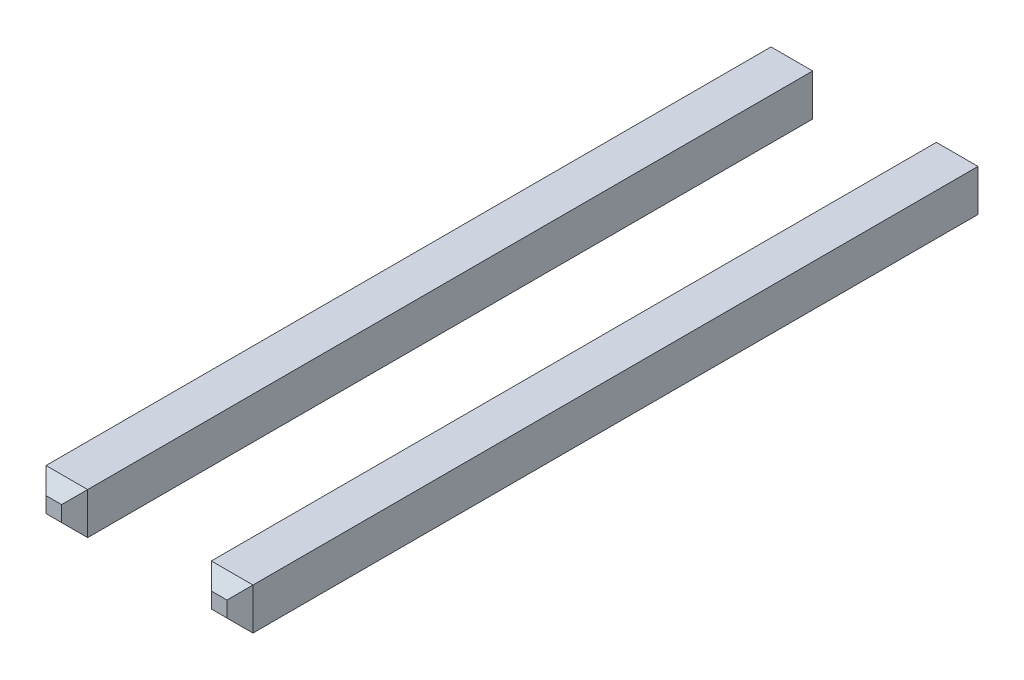
ISO-10303-21;
HEADER;
FILE_DESCRIPTION(('STEP AP214'),'2;1');
FILE_NAME('part.step','',(''),(''),'','','');
FILE_SCHEMA(('AUTOMOTIVE_DESIGN { 1 0 10303 214 1 1 1 1 }'));
ENDSEC;
DATA;
#1=APPLICATION_CONTEXT('core data for automotive mechanical design processes');
#2=APPLICATION_PROTOCOL_DEFINITION('international standard','automotive_design',2000,#1);
#3=PRODUCT_CONTEXT('',#1,'mechanical');
#4=PRODUCT('Part','Part','',(#3));
#5=PRODUCT_RELATED_PRODUCT_CATEGORY('part','',(#4));
#6=PRODUCT_DEFINITION_FORMATION('','',#4);
#7=PRODUCT_DEFINITION_CONTEXT('part definition',#1,'design');
#8=PRODUCT_DEFINITION('design','',#6,#7);
#9=PRODUCT_DEFINITION_SHAPE('','',#8);
#10=(LENGTH_UNIT() NAMED_UNIT(*) SI_UNIT(.MILLI.,.METRE.));
#11=(NAMED_UNIT(*) PLANE_ANGLE_UNIT() SI_UNIT($,.RADIAN.));
#12=(NAMED_UNIT(*) SI_UNIT($,.STERADIAN.) SOLID_ANGLE_UNIT());
#13=UNCERTAINTY_MEASURE_WITH_UNIT(LENGTH_MEASURE(1.E-05),#10,'distance_accuracy_value','');
#14=(GEOMETRIC_REPRESENTATION_CONTEXT(3) GLOBAL_UNCERTAINTY_ASSIGNED_CONTEXT((#13)) GLOBAL_UNIT_ASSIGNED_CONTEXT((#10,
#11,#12)) REPRESENTATION_CONTEXT('',''));
#15=CARTESIAN_POINT('',(0.,0.,0.));
#16=DIRECTION('',(0.,0.,1.));
#17=DIRECTION('',(1.,0.,0.));
#18=AXIS2_PLACEMENT_3D('',#15,#16,#17);
#19=CARTESIAN_POINT('',(2.859999961853,-0.21999999851,-2.89999999851));
#20=DIRECTION('',(0.,0.707106781186548,0.707106781186548));
#21=DIRECTION('',(0.,-0.707106781186548,0.707106781186548));
#22=AXIS2_PLACEMENT_3D('',#19,#20,#21);
#23=PLANE('',#22);
#24=DIRECTION('',(0.577350269189626,0.577350269189625,-0.577350269189626));
#25=VECTOR('',#24,1.);
#26=CARTESIAN_POINT('',(2.219999961853,-0.32,-2.79999999702));
#27=LINE('',#26,#25);
#28=CARTESIAN_POINT('',(2.219999961853,-0.32,-2.79999999702));
#29=VERTEX_POINT('',#28);
#30=CARTESIAN_POINT('',(2.419999964833,-0.11999999702,-3.));
#31=VERTEX_POINT('',#30);
#32=EDGE_CURVE('P0_E78',#29,#31,#27,.T.);
#33=ORIENTED_EDGE('',*,*,#32,.T.);
#34=DIRECTION('',(1.,0.,0.));
#35=VECTOR('',#34,1.);
#36=CARTESIAN_POINT('',(2.219999961853,-0.11999999702,-3.));
#37=LINE('',#36,#35);
#38=CARTESIAN_POINT('',(2.659999958873,-0.11999999702,-3.));
#39=VERTEX_POINT('',#38);
#40=EDGE_CURVE('P0_E19',#31,#39,#37,.T.);
#41=ORIENTED_EDGE('',*,*,#40,.T.);
#42=DIRECTION('',(0.577350269189626,-0.577350269189625,0.577350269189626));
#43=VECTOR('',#42,1.);
#44=CARTESIAN_POINT('',(2.659999958873,-0.11999999702,-3.));
#45=LINE('',#44,#43);
#46=CARTESIAN_POINT('',(2.859999961853,-0.32,-2.79999999702));
#47=VERTEX_POINT('',#46);
#48=EDGE_CURVE('P0_E82',#39,#47,#45,.T.);
#49=ORIENTED_EDGE('',*,*,#48,.T.);
#50=DIRECTION('',(1.,0.,0.));
#51=VECTOR('',#50,1.);
#52=CARTESIAN_POINT('',(2.859999961853,-0.32,-2.79999999702));
#53=LINE('',#52,#51);
#54=EDGE_CURVE('P0_E103',#29,#47,#53,.T.);
#55=ORIENTED_EDGE('',*,*,#54,.F.);
#56=EDGE_LOOP('',(#33,#41,#49,#55));
#57=FACE_BOUND('',#56,.T.);
#58=ADVANCED_FACE('P0_F16',(#57),#23,.F.);
#59=CARTESIAN_POINT('',(2.859999961853,-0.21999999851,8.439999960363));
#60=DIRECTION('',(0.,-0.707106781186548,0.707106781186548));
#61=DIRECTION('',(0.,-0.707106781186548,-0.707106781186548));
#62=AXIS2_PLACEMENT_3D('',#59,#60,#61);
#63=PLANE('',#62);
#64=DIRECTION('',(1.,0.,0.));
#65=VECTOR('',#64,1.);
#66=CARTESIAN_POINT('',(2.219999961853,-0.11999999702,8.539999961853));
#67=LINE('',#66,#65);
#68=CARTESIAN_POINT('',(2.419999964833,-0.11999999702,8.539999961853));
#69=VERTEX_POINT('',#68);
#70=CARTESIAN_POINT('',(2.659999958873,-0.11999999702,8.539999961853));
#71=VERTEX_POINT('',#70);
#72=EDGE_CURVE('P0_E113',#69,#71,#67,.T.);
#73=ORIENTED_EDGE('',*,*,#72,.F.);
#74=DIRECTION('',(0.577350269189627,0.577350269189625,0.577350269189626));
#75=VECTOR('',#74,1.);
#76=CARTESIAN_POINT('',(2.219999961853,-0.32,8.339999958873));
#77=LINE('',#76,#75);
#78=CARTESIAN_POINT('',(2.219999961853,-0.32,8.339999958873));
#79=VERTEX_POINT('',#78);
#80=EDGE_CURVE('P0_E108',#79,#69,#77,.T.);
#81=ORIENTED_EDGE('',*,*,#80,.F.);
#82=DIRECTION('',(1.,0.,0.));
#83=VECTOR('',#82,1.);
#84=CARTESIAN_POINT('',(2.859999961853,-0.32,8.339999958873));
#85=LINE('',#84,#83);
#86=CARTESIAN_POINT('',(2.859999961853,-0.32,8.339999958873));
#87=VERTEX_POINT('',#86);
#88=EDGE_CURVE('P0_E105',#87,#79,#85,.F.);
#89=ORIENTED_EDGE('',*,*,#88,.F.);
#90=DIRECTION('',(0.577350269189627,-0.577350269189625,-0.577350269189626));
#91=VECTOR('',#90,1.);
#92=CARTESIAN_POINT('',(2.659999958873,-0.11999999702,8.539999961853));
#93=LINE('',#92,#91);
#94=EDGE_CURVE('P0_E118',#71,#87,#93,.T.);
#95=ORIENTED_EDGE('',*,*,#94,.F.);
#96=EDGE_LOOP('',(#73,#81,#89,#95));
#97=FACE_BOUND('',#96,.T.);
#98=ADVANCED_FACE('P0_F183',(#97),#63,.T.);
#99=CARTESIAN_POINT('',(2.219999961853,0.32,-3.));
#100=DIRECTION('',(0.,0.,1.));
#101=DIRECTION('',(1.,0.,0.));
#102=AXIS2_PLACEMENT_3D('',#99,#100,#101);
#103=PLANE('',#102);
#104=DIRECTION('',(0.,1.,0.));
#105=VECTOR('',#104,1.);
#106=CARTESIAN_POINT('',(2.659999958873,0.32,-3.));
#107=LINE('',#106,#105);
#108=CARTESIAN_POINT('',(2.659999958873,0.11999999702,-3.));
#109=VERTEX_POINT('',#108);
#110=EDGE_CURVE('P0_E86',#109,#39,#107,.F.);
#111=ORIENTED_EDGE('',*,*,#110,.T.);
#112=ORIENTED_EDGE('',*,*,#40,.F.);
#113=DIRECTION('',(0.,1.,0.));
#114=VECTOR('',#113,1.);
#115=CARTESIAN_POINT('',(2.419999964833,-0.32,-3.));
#116=LINE('',#115,#114);
#117=CARTESIAN_POINT('',(2.419999964833,0.11999999702,-3.));
#118=VERTEX_POINT('',#117);
#119=EDGE_CURVE('P0_E99',#31,#118,#116,.T.);
#120=ORIENTED_EDGE('',*,*,#119,.T.);
#121=DIRECTION('',(1.,0.,0.));
#122=VECTOR('',#121,1.);
#123=CARTESIAN_POINT('',(2.219999961853,0.11999999702,-3.));
#124=LINE('',#123,#122);
#125=EDGE_CURVE('P0_E90',#118,#109,#124,.T.);
#126=ORIENTED_EDGE('',*,*,#125,.T.);
#127=EDGE_LOOP('',(#111,#112,#120,#126));
#128=FACE_BOUND('',#127,.T.);
#129=ADVANCED_FACE('P0_F88',(#128),#103,.F.);
#130=CARTESIAN_POINT('',(2.759999960363,0.32,-2.89999999851));
#131=DIRECTION('',(-0.707106781186548,0.,0.707106781186548));
#132=DIRECTION('',(0.707106781186548,0.,0.707106781186548));
#133=AXIS2_PLACEMENT_3D('',#130,#131,#132);
#134=PLANE('',#133);
#135=ORIENTED_EDGE('',*,*,#48,.F.);
#136=ORIENTED_EDGE('',*,*,#110,.F.);
#137=DIRECTION('',(0.577350269189625,0.577350269189626,0.577350269189626));
#138=VECTOR('',#137,1.);
#139=CARTESIAN_POINT('',(2.659999958873,0.11999999702,-3.));
#140=LINE('',#139,#138);
#141=CARTESIAN_POINT('',(2.859999961853,0.32,-2.79999999702));
#142=VERTEX_POINT('',#141);
#143=EDGE_CURVE('P0_E131',#109,#142,#140,.T.);
#144=ORIENTED_EDGE('',*,*,#143,.T.);
#145=DIRECTION('',(0.,1.,0.));
#146=VECTOR('',#145,1.);
#147=CARTESIAN_POINT('',(2.859999961853,0.32,-2.79999999702));
#148=LINE('',#147,#146);
#149=EDGE_CURVE('P0_E96',#47,#142,#148,.T.);
#150=ORIENTED_EDGE('',*,*,#149,.F.);
#151=EDGE_LOOP('',(#135,#136,#144,#150));
#152=FACE_BOUND('',#151,.T.);
#153=ADVANCED_FACE('P0_F94',(#152),#134,.F.);
#154=CARTESIAN_POINT('',(2.319999963343,-0.32,-2.89999999851));
#155=DIRECTION('',(0.707106781186548,0.,0.707106781186548));
#156=DIRECTION('',(0.707106781186548,0.,-0.707106781186548));
#157=AXIS2_PLACEMENT_3D('',#154,#155,#156);
#158=PLANE('',#157);
#159=DIRECTION('',(0.577350269189626,-0.577350269189626,-0.577350269189626));
#160=VECTOR('',#159,1.);
#161=CARTESIAN_POINT('',(2.219999961853,0.32,-2.79999999702));
#162=LINE('',#161,#160);
#163=CARTESIAN_POINT('',(2.219999961853,0.32,-2.79999999702));
#164=VERTEX_POINT('',#163);
#165=EDGE_CURVE('P0_E127',#164,#118,#162,.T.);
#166=ORIENTED_EDGE('',*,*,#165,.T.);
#167=ORIENTED_EDGE('',*,*,#119,.F.);
#168=ORIENTED_EDGE('',*,*,#32,.F.);
#169=DIRECTION('',(0.,1.,0.));
#170=VECTOR('',#169,1.);
#171=CARTESIAN_POINT('',(2.219999961853,-0.32,-2.79999999702));
#172=LINE('',#171,#170);
#173=EDGE_CURVE('P0_E133',#164,#29,#172,.F.);
#174=ORIENTED_EDGE('',*,*,#173,.F.);
#175=EDGE_LOOP('',(#166,#167,#168,#174));
#176=FACE_BOUND('',#175,.T.);
#177=ADVANCED_FACE('P0_F178',(#176),#158,.F.);
#178=CARTESIAN_POINT('',(2.859999961853,-0.32,-3.));
#179=DIRECTION('',(0.,-1.,0.));
#180=DIRECTION('',(0.,0.,-1.));
#181=AXIS2_PLACEMENT_3D('',#178,#179,#180);
#182=PLANE('',#181);
#183=DIRECTION('',(0.,0.,-1.));
#184=VECTOR('',#183,1.);
#185=CARTESIAN_POINT('',(2.859999961853,-0.32,-3.));
#186=LINE('',#185,#184);
#187=EDGE_CURVE('P0_E121',#87,#47,#186,.T.);
#188=ORIENTED_EDGE('',*,*,#187,.F.);
#189=ORIENTED_EDGE('',*,*,#88,.T.);
#190=DIRECTION('',(0.,0.,1.));
#191=VECTOR('',#190,1.);
#192=CARTESIAN_POINT('',(2.219999961853,-0.32,-3.));
#193=LINE('',#192,#191);
#194=EDGE_CURVE('P0_E136',#29,#79,#193,.T.);
#195=ORIENTED_EDGE('',*,*,#194,.F.);
#196=ORIENTED_EDGE('',*,*,#54,.T.);
#197=EDGE_LOOP('',(#188,#189,#195,#196));
#198=FACE_BOUND('',#197,.T.);
#199=ADVANCED_FACE('P0_F180',(#198),#182,.T.);
#200=CARTESIAN_POINT('',(2.319999963343,-0.32,8.439999960363));
#201=DIRECTION('',(-0.707106781186548,0.,0.707106781186548));
#202=DIRECTION('',(0.707106781186548,0.,0.707106781186548));
#203=AXIS2_PLACEMENT_3D('',#200,#201,#202);
#204=PLANE('',#203);
#205=DIRECTION('',(0.,1.,0.));
#206=VECTOR('',#205,1.);
#207=CARTESIAN_POINT('',(2.419999964833,0.32,8.539999961853));
#208=LINE('',#207,#206);
#209=CARTESIAN_POINT('',(2.419999964833,0.11999999702,8.539999961853));
#210=VERTEX_POINT('',#209);
#211=EDGE_CURVE('P0_E110',#210,#69,#208,.F.);
#212=ORIENTED_EDGE('',*,*,#211,.F.);
#213=DIRECTION('',(0.577350269189625,-0.577350269189627,0.577350269189626));
#214=VECTOR('',#213,1.);
#215=CARTESIAN_POINT('',(2.219999961853,0.320000000000001,8.339999958873));
#216=LINE('',#215,#214);
#217=CARTESIAN_POINT('',(2.219999961853,0.32,8.339999958873));
#218=VERTEX_POINT('',#217);
#219=EDGE_CURVE('P0_E34',#218,#210,#216,.T.);
#220=ORIENTED_EDGE('',*,*,#219,.F.);
#221=DIRECTION('',(0.,1.,0.));
#222=VECTOR('',#221,1.);
#223=CARTESIAN_POINT('',(2.219999961853,-0.32,8.339999958873));
#224=LINE('',#223,#222);
#225=EDGE_CURVE('P0_E139',#79,#218,#224,.T.);
#226=ORIENTED_EDGE('',*,*,#225,.F.);
#227=ORIENTED_EDGE('',*,*,#80,.T.);
#228=EDGE_LOOP('',(#212,#220,#226,#227));
#229=FACE_BOUND('',#228,.T.);
#230=ADVANCED_FACE('P0_F184',(#229),#204,.T.);
#231=CARTESIAN_POINT('',(2.219999961853,0.32,8.539999961853));
#232=DIRECTION('',(0.,0.,1.));
#233=DIRECTION('',(1.,0.,0.));
#234=AXIS2_PLACEMENT_3D('',#231,#232,#233);
#235=PLANE('',#234);
#236=ORIENTED_EDGE('',*,*,#211,.T.);
#237=ORIENTED_EDGE('',*,*,#72,.T.);
#238=DIRECTION('',(0.,1.,0.));
#239=VECTOR('',#238,1.);
#240=CARTESIAN_POINT('',(2.659999958873,0.32,8.539999961853));
#241=LINE('',#240,#239);
#242=CARTESIAN_POINT('',(2.659999958873,0.11999999702,8.539999961853));
#243=VERTEX_POINT('',#242);
#244=EDGE_CURVE('P0_E115',#243,#71,#241,.F.);
#245=ORIENTED_EDGE('',*,*,#244,.F.);
#246=DIRECTION('',(1.,0.,0.));
#247=VECTOR('',#246,1.);
#248=CARTESIAN_POINT('',(2.219999961853,0.11999999702,8.539999961853));
#249=LINE('',#248,#247);
#250=EDGE_CURVE('P0_E142',#210,#243,#249,.T.);
#251=ORIENTED_EDGE('',*,*,#250,.F.);
#252=EDGE_LOOP('',(#236,#237,#245,#251));
#253=FACE_BOUND('',#252,.T.);
#254=ADVANCED_FACE('P0_F186',(#253),#235,.T.);
#255=CARTESIAN_POINT('',(2.759999960363,0.32,8.439999960363));
#256=DIRECTION('',(0.707106781186548,0.,0.707106781186548));
#257=DIRECTION('',(0.707106781186548,0.,-0.707106781186548));
#258=AXIS2_PLACEMENT_3D('',#255,#256,#257);
#259=PLANE('',#258);
#260=ORIENTED_EDGE('',*,*,#244,.T.);
#261=ORIENTED_EDGE('',*,*,#94,.T.);
#262=DIRECTION('',(0.,1.,0.));
#263=VECTOR('',#262,1.);
#264=CARTESIAN_POINT('',(2.859999961853,0.32,8.339999958873));
#265=LINE('',#264,#263);
#266=CARTESIAN_POINT('',(2.859999961853,0.32,8.339999958873));
#267=VERTEX_POINT('',#266);
#268=EDGE_CURVE('P0_E124',#267,#87,#265,.F.);
#269=ORIENTED_EDGE('',*,*,#268,.F.);
#270=DIRECTION('',(0.577350269189624,0.577350269189627,-0.577350269189626));
#271=VECTOR('',#270,1.);
#272=CARTESIAN_POINT('',(2.659999958873,0.11999999702,8.539999961853));
#273=LINE('',#272,#271);
#274=EDGE_CURVE('P0_E145',#243,#267,#273,.T.);
#275=ORIENTED_EDGE('',*,*,#274,.F.);
#276=EDGE_LOOP('',(#260,#261,#269,#275));
#277=FACE_BOUND('',#276,.T.);
#278=ADVANCED_FACE('P0_F168',(#277),#259,.T.);
#279=CARTESIAN_POINT('',(2.859999961853,0.32,-3.));
#280=DIRECTION('',(1.,0.,0.));
#281=DIRECTION('',(0.,0.,-1.));
#282=AXIS2_PLACEMENT_3D('',#279,#280,#281);
#283=PLANE('',#282);
#284=DIRECTION('',(0.,0.,1.));
#285=VECTOR('',#284,1.);
#286=CARTESIAN_POINT('',(2.859999961853,0.32,-3.));
#287=LINE('',#286,#285);
#288=EDGE_CURVE('P0_E148',#267,#142,#287,.F.);
#289=ORIENTED_EDGE('',*,*,#288,.F.);
#290=ORIENTED_EDGE('',*,*,#268,.T.);
#291=ORIENTED_EDGE('',*,*,#187,.T.);
#292=ORIENTED_EDGE('',*,*,#149,.T.);
#293=EDGE_LOOP('',(#289,#290,#291,#292));
#294=FACE_BOUND('',#293,.T.);
#295=ADVANCED_FACE('P0_F172',(#294),#283,.T.);
#296=CARTESIAN_POINT('',(2.219999961853,0.21999999851,-2.89999999851));
#297=DIRECTION('',(0.,-0.707106781186548,0.707106781186548));
#298=DIRECTION('',(0.,-0.707106781186548,-0.707106781186548));
#299=AXIS2_PLACEMENT_3D('',#296,#297,#298);
#300=PLANE('',#299);
#301=ORIENTED_EDGE('',*,*,#143,.F.);
#302=ORIENTED_EDGE('',*,*,#125,.F.);
#303=ORIENTED_EDGE('',*,*,#165,.F.);
#304=DIRECTION('',(1.,0.,0.));
#305=VECTOR('',#304,1.);
#306=CARTESIAN_POINT('',(2.219999961853,0.32,-2.79999999702));
#307=LINE('',#306,#305);
#308=EDGE_CURVE('P0_E151',#142,#164,#307,.F.);
#309=ORIENTED_EDGE('',*,*,#308,.F.);
#310=EDGE_LOOP('',(#301,#302,#303,#309));
#311=FACE_BOUND('',#310,.T.);
#312=ADVANCED_FACE('P0_F176',(#311),#300,.F.);
#313=CARTESIAN_POINT('',(2.219999961853,-0.32,-3.));
#314=DIRECTION('',(-1.,0.,0.));
#315=DIRECTION('',(0.,0.,1.));
#316=AXIS2_PLACEMENT_3D('',#313,#314,#315);
#317=PLANE('',#316);
#318=ORIENTED_EDGE('',*,*,#194,.T.);
#319=ORIENTED_EDGE('',*,*,#225,.T.);
#320=DIRECTION('',(0.,0.,1.));
#321=VECTOR('',#320,1.);
#322=CARTESIAN_POINT('',(2.219999961853,0.32,-3.));
#323=LINE('',#322,#321);
#324=EDGE_CURVE('P0_E25',#164,#218,#323,.T.);
#325=ORIENTED_EDGE('',*,*,#324,.F.);
#326=ORIENTED_EDGE('',*,*,#173,.T.);
#327=EDGE_LOOP('',(#318,#319,#325,#326));
#328=FACE_BOUND('',#327,.T.);
#329=ADVANCED_FACE('P0_F161',(#328),#317,.T.);
#330=CARTESIAN_POINT('',(2.219999961853,0.21999999851,8.439999960363));
#331=DIRECTION('',(0.,0.707106781186548,0.707106781186548));
#332=DIRECTION('',(0.,-0.707106781186548,0.707106781186548));
#333=AXIS2_PLACEMENT_3D('',#330,#331,#332);
#334=PLANE('',#333);
#335=ORIENTED_EDGE('',*,*,#250,.T.);
#336=ORIENTED_EDGE('',*,*,#274,.T.);
#337=DIRECTION('',(1.,0.,0.));
#338=VECTOR('',#337,1.);
#339=CARTESIAN_POINT('',(2.219999961853,0.32,8.339999958873));
#340=LINE('',#339,#338);
#341=EDGE_CURVE('P0_E11',#218,#267,#340,.T.);
#342=ORIENTED_EDGE('',*,*,#341,.F.);
#343=ORIENTED_EDGE('',*,*,#219,.T.);
#344=EDGE_LOOP('',(#335,#336,#342,#343));
#345=FACE_BOUND('',#344,.T.);
#346=ADVANCED_FACE('P0_F164',(#345),#334,.T.);
#347=CARTESIAN_POINT('',(2.219999961853,0.32,-3.));
#348=DIRECTION('',(0.,1.,0.));
#349=DIRECTION('',(0.,0.,1.));
#350=AXIS2_PLACEMENT_3D('',#347,#348,#349);
#351=PLANE('',#350);
#352=ORIENTED_EDGE('',*,*,#324,.T.);
#353=ORIENTED_EDGE('',*,*,#341,.T.);
#354=ORIENTED_EDGE('',*,*,#288,.T.);
#355=ORIENTED_EDGE('',*,*,#308,.T.);
#356=EDGE_LOOP('',(#352,#353,#354,#355));
#357=FACE_BOUND('',#356,.T.);
#358=ADVANCED_FACE('P0_F157',(#357),#351,.T.);
#359=CLOSED_SHELL('',(#58,#98,#129,#153,#177,#199,#230,#254,#278,#295,#312,#329,#346,#358));
#360=MANIFOLD_SOLID_BREP('P0_B1',#359);
#361=CARTESIAN_POINT('',(0.32,-0.21999999851,-2.89999999851));
#362=DIRECTION('',(0.,0.707106781186548,0.707106781186548));
#363=DIRECTION('',(0.,-0.707106781186548,0.707106781186548));
#364=AXIS2_PLACEMENT_3D('',#361,#362,#363);
#365=PLANE('',#364);
#366=DIRECTION('',(0.577350269189626,0.577350269189626,-0.577350269189626));
#367=VECTOR('',#366,1.);
#368=CARTESIAN_POINT('',(-0.32,-0.32,-2.79999999702));
#369=LINE('',#368,#367);
#370=CARTESIAN_POINT('',(-0.32,-0.32,-2.79999999702));
#371=VERTEX_POINT('',#370);
#372=CARTESIAN_POINT('',(-0.11999999702,-0.11999999702,-3.));
#373=VERTEX_POINT('',#372);
#374=EDGE_CURVE('P1_E78',#371,#373,#369,.T.);
#375=ORIENTED_EDGE('',*,*,#374,.T.);
#376=DIRECTION('',(1.,0.,0.));
#377=VECTOR('',#376,1.);
#378=CARTESIAN_POINT('',(-0.32,-0.11999999702,-3.));
#379=LINE('',#378,#377);
#380=CARTESIAN_POINT('',(0.11999999702,-0.11999999702,-3.));
#381=VERTEX_POINT('',#380);
#382=EDGE_CURVE('P1_E19',#373,#381,#379,.T.);
#383=ORIENTED_EDGE('',*,*,#382,.T.);
#384=DIRECTION('',(0.577350269189626,-0.577350269189626,0.577350269189626));
#385=VECTOR('',#384,1.);
#386=CARTESIAN_POINT('',(0.11999999702,-0.11999999702,-3.));
#387=LINE('',#386,#385);
#388=CARTESIAN_POINT('',(0.32,-0.32,-2.79999999702));
#389=VERTEX_POINT('',#388);
#390=EDGE_CURVE('P1_E82',#381,#389,#387,.T.);
#391=ORIENTED_EDGE('',*,*,#390,.T.);
#392=DIRECTION('',(1.,0.,0.));
#393=VECTOR('',#392,1.);
#394=CARTESIAN_POINT('',(0.32,-0.32,-2.79999999702));
#395=LINE('',#394,#393);
#396=EDGE_CURVE('P1_E103',#371,#389,#395,.T.);
#397=ORIENTED_EDGE('',*,*,#396,.F.);
#398=EDGE_LOOP('',(#375,#383,#391,#397));
#399=FACE_BOUND('',#398,.T.);
#400=ADVANCED_FACE('P1_F16',(#399),#365,.F.);
#401=CARTESIAN_POINT('',(0.32,-0.21999999851,8.439999960363));
#402=DIRECTION('',(0.,-0.707106781186548,0.707106781186548));
#403=DIRECTION('',(0.,-0.707106781186548,-0.707106781186548));
#404=AXIS2_PLACEMENT_3D('',#401,#402,#403);
#405=PLANE('',#404);
#406=DIRECTION('',(1.,0.,0.));
#407=VECTOR('',#406,1.);
#408=CARTESIAN_POINT('',(-0.32,-0.11999999702,8.539999961853));
#409=LINE('',#408,#407);
#410=CARTESIAN_POINT('',(-0.11999999702,-0.11999999702,8.539999961853));
#411=VERTEX_POINT('',#410);
#412=CARTESIAN_POINT('',(0.11999999702,-0.11999999702,8.539999961853));
#413=VERTEX_POINT('',#412);
#414=EDGE_CURVE('P1_E113',#411,#413,#409,.T.);
#415=ORIENTED_EDGE('',*,*,#414,.F.);
#416=DIRECTION('',(0.577350269189627,0.577350269189625,0.577350269189626));
#417=VECTOR('',#416,1.);
#418=CARTESIAN_POINT('',(-0.320000000000001,-0.32,8.339999958873));
#419=LINE('',#418,#417);
#420=CARTESIAN_POINT('',(-0.32,-0.32,8.339999958873));
#421=VERTEX_POINT('',#420);
#422=EDGE_CURVE('P1_E108',#421,#411,#419,.T.);
#423=ORIENTED_EDGE('',*,*,#422,.F.);
#424=DIRECTION('',(1.,0.,0.));
#425=VECTOR('',#424,1.);
#426=CARTESIAN_POINT('',(0.32,-0.32,8.339999958873));
#427=LINE('',#426,#425);
#428=CARTESIAN_POINT('',(0.32,-0.32,8.339999958873));
#429=VERTEX_POINT('',#428);
#430=EDGE_CURVE('P1_E105',#429,#421,#427,.F.);
#431=ORIENTED_EDGE('',*,*,#430,.F.);
#432=DIRECTION('',(0.577350269189627,-0.577350269189625,-0.577350269189626));
#433=VECTOR('',#432,1.);
#434=CARTESIAN_POINT('',(0.11999999702,-0.11999999702,8.539999961853));
#435=LINE('',#434,#433);
#436=EDGE_CURVE('P1_E118',#413,#429,#435,.T.);
#437=ORIENTED_EDGE('',*,*,#436,.F.);
#438=EDGE_LOOP('',(#415,#423,#431,#437));
#439=FACE_BOUND('',#438,.T.);
#440=ADVANCED_FACE('P1_F183',(#439),#405,.T.);
#441=CARTESIAN_POINT('',(-0.32,0.32,-3.));
#442=DIRECTION('',(0.,0.,1.));
#443=DIRECTION('',(1.,0.,0.));
#444=AXIS2_PLACEMENT_3D('',#441,#442,#443);
#445=PLANE('',#444);
#446=DIRECTION('',(0.,1.,0.));
#447=VECTOR('',#446,1.);
#448=CARTESIAN_POINT('',(0.11999999702,0.32,-3.));
#449=LINE('',#448,#447);
#450=CARTESIAN_POINT('',(0.11999999702,0.11999999702,-3.));
#451=VERTEX_POINT('',#450);
#452=EDGE_CURVE('P1_E86',#451,#381,#449,.F.);
#453=ORIENTED_EDGE('',*,*,#452,.T.);
#454=ORIENTED_EDGE('',*,*,#382,.F.);
#455=DIRECTION('',(0.,1.,0.));
#456=VECTOR('',#455,1.);
#457=CARTESIAN_POINT('',(-0.11999999702,-0.32,-3.));
#458=LINE('',#457,#456);
#459=CARTESIAN_POINT('',(-0.11999999702,0.11999999702,-3.));
#460=VERTEX_POINT('',#459);
#461=EDGE_CURVE('P1_E99',#373,#460,#458,.T.);
#462=ORIENTED_EDGE('',*,*,#461,.T.);
#463=DIRECTION('',(1.,0.,0.));
#464=VECTOR('',#463,1.);
#465=CARTESIAN_POINT('',(-0.32,0.11999999702,-3.));
#466=LINE('',#465,#464);
#467=EDGE_CURVE('P1_E90',#460,#451,#466,.T.);
#468=ORIENTED_EDGE('',*,*,#467,.T.);
#469=EDGE_LOOP('',(#453,#454,#462,#468));
#470=FACE_BOUND('',#469,.T.);
#471=ADVANCED_FACE('P1_F88',(#470),#445,.F.);
#472=CARTESIAN_POINT('',(0.21999999851,0.32,-2.89999999851));
#473=DIRECTION('',(-0.707106781186548,0.,0.707106781186548));
#474=DIRECTION('',(0.707106781186548,0.,0.707106781186548));
#475=AXIS2_PLACEMENT_3D('',#472,#473,#474);
#476=PLANE('',#475);
#477=ORIENTED_EDGE('',*,*,#390,.F.);
#478=ORIENTED_EDGE('',*,*,#452,.F.);
#479=DIRECTION('',(0.577350269189626,0.577350269189626,0.577350269189626));
#480=VECTOR('',#479,1.);
#481=CARTESIAN_POINT('',(0.11999999702,0.11999999702,-3.));
#482=LINE('',#481,#480);
#483=CARTESIAN_POINT('',(0.32,0.32,-2.79999999702));
#484=VERTEX_POINT('',#483);
#485=EDGE_CURVE('P1_E131',#451,#484,#482,.T.);
#486=ORIENTED_EDGE('',*,*,#485,.T.);
#487=DIRECTION('',(0.,1.,0.));
#488=VECTOR('',#487,1.);
#489=CARTESIAN_POINT('',(0.32,0.32,-2.79999999702));
#490=LINE('',#489,#488);
#491=EDGE_CURVE('P1_E96',#389,#484,#490,.T.);
#492=ORIENTED_EDGE('',*,*,#491,.F.);
#493=EDGE_LOOP('',(#477,#478,#486,#492));
#494=FACE_BOUND('',#493,.T.);
#495=ADVANCED_FACE('P1_F94',(#494),#476,.F.);
#496=CARTESIAN_POINT('',(-0.21999999851,-0.32,-2.89999999851));
#497=DIRECTION('',(0.707106781186548,0.,0.707106781186548));
#498=DIRECTION('',(0.707106781186548,0.,-0.707106781186548));
#499=AXIS2_PLACEMENT_3D('',#496,#497,#498);
#500=PLANE('',#499);
#501=DIRECTION('',(0.577350269189626,-0.577350269189626,-0.577350269189626));
#502=VECTOR('',#501,1.);
#503=CARTESIAN_POINT('',(-0.32,0.32,-2.79999999702));
#504=LINE('',#503,#502);
#505=CARTESIAN_POINT('',(-0.32,0.32,-2.79999999702));
#506=VERTEX_POINT('',#505);
#507=EDGE_CURVE('P1_E127',#506,#460,#504,.T.);
#508=ORIENTED_EDGE('',*,*,#507,.T.);
#509=ORIENTED_EDGE('',*,*,#461,.F.);
#510=ORIENTED_EDGE('',*,*,#374,.F.);
#511=DIRECTION('',(0.,1.,0.));
#512=VECTOR('',#511,1.);
#513=CARTESIAN_POINT('',(-0.32,-0.32,-2.79999999702));
#514=LINE('',#513,#512);
#515=EDGE_CURVE('P1_E133',#506,#371,#514,.F.);
#516=ORIENTED_EDGE('',*,*,#515,.F.);
#517=EDGE_LOOP('',(#508,#509,#510,#516));
#518=FACE_BOUND('',#517,.T.);
#519=ADVANCED_FACE('P1_F178',(#518),#500,.F.);
#520=CARTESIAN_POINT('',(0.32,-0.32,-3.));
#521=DIRECTION('',(0.,-1.,0.));
#522=DIRECTION('',(0.,0.,-1.));
#523=AXIS2_PLACEMENT_3D('',#520,#521,#522);
#524=PLANE('',#523);
#525=DIRECTION('',(0.,0.,-1.));
#526=VECTOR('',#525,1.);
#527=CARTESIAN_POINT('',(0.32,-0.32,-3.));
#528=LINE('',#527,#526);
#529=EDGE_CURVE('P1_E121',#429,#389,#528,.T.);
#530=ORIENTED_EDGE('',*,*,#529,.F.);
#531=ORIENTED_EDGE('',*,*,#430,.T.);
#532=DIRECTION('',(0.,0.,1.));
#533=VECTOR('',#532,1.);
#534=CARTESIAN_POINT('',(-0.32,-0.32,-3.));
#535=LINE('',#534,#533);
#536=EDGE_CURVE('P1_E136',#371,#421,#535,.T.);
#537=ORIENTED_EDGE('',*,*,#536,.F.);
#538=ORIENTED_EDGE('',*,*,#396,.T.);
#539=EDGE_LOOP('',(#530,#531,#537,#538));
#540=FACE_BOUND('',#539,.T.);
#541=ADVANCED_FACE('P1_F180',(#540),#524,.T.);
#542=CARTESIAN_POINT('',(-0.21999999851,-0.32,8.439999960363));
#543=DIRECTION('',(-0.707106781186548,0.,0.707106781186548));
#544=DIRECTION('',(0.707106781186548,0.,0.707106781186548));
#545=AXIS2_PLACEMENT_3D('',#542,#543,#544);
#546=PLANE('',#545);
#547=DIRECTION('',(0.,1.,0.));
#548=VECTOR('',#547,1.);
#549=CARTESIAN_POINT('',(-0.11999999702,0.32,8.539999961853));
#550=LINE('',#549,#548);
#551=CARTESIAN_POINT('',(-0.11999999702,0.11999999702,8.539999961853));
#552=VERTEX_POINT('',#551);
#553=EDGE_CURVE('P1_E110',#552,#411,#550,.F.);
#554=ORIENTED_EDGE('',*,*,#553,.F.);
#555=DIRECTION('',(0.577350269189625,-0.577350269189627,0.577350269189626));
#556=VECTOR('',#555,1.);
#557=CARTESIAN_POINT('',(-0.32,0.320000000000001,8.339999958873));
#558=LINE('',#557,#556);
#559=CARTESIAN_POINT('',(-0.32,0.32,8.339999958873));
#560=VERTEX_POINT('',#559);
#561=EDGE_CURVE('P1_E34',#560,#552,#558,.T.);
#562=ORIENTED_EDGE('',*,*,#561,.F.);
#563=DIRECTION('',(0.,1.,0.));
#564=VECTOR('',#563,1.);
#565=CARTESIAN_POINT('',(-0.32,-0.32,8.339999958873));
#566=LINE('',#565,#564);
#567=EDGE_CURVE('P1_E139',#421,#560,#566,.T.);
#568=ORIENTED_EDGE('',*,*,#567,.F.);
#569=ORIENTED_EDGE('',*,*,#422,.T.);
#570=EDGE_LOOP('',(#554,#562,#568,#569));
#571=FACE_BOUND('',#570,.T.);
#572=ADVANCED_FACE('P1_F184',(#571),#546,.T.);
#573=CARTESIAN_POINT('',(-0.32,0.32,8.539999961853));
#574=DIRECTION('',(0.,0.,1.));
#575=DIRECTION('',(1.,0.,0.));
#576=AXIS2_PLACEMENT_3D('',#573,#574,#575);
#577=PLANE('',#576);
#578=ORIENTED_EDGE('',*,*,#553,.T.);
#579=ORIENTED_EDGE('',*,*,#414,.T.);
#580=DIRECTION('',(0.,1.,0.));
#581=VECTOR('',#580,1.);
#582=CARTESIAN_POINT('',(0.11999999702,0.32,8.539999961853));
#583=LINE('',#582,#581);
#584=CARTESIAN_POINT('',(0.11999999702,0.11999999702,8.539999961853));
#585=VERTEX_POINT('',#584);
#586=EDGE_CURVE('P1_E115',#585,#413,#583,.F.);
#587=ORIENTED_EDGE('',*,*,#586,.F.);
#588=DIRECTION('',(1.,0.,0.));
#589=VECTOR('',#588,1.);
#590=CARTESIAN_POINT('',(-0.32,0.11999999702,8.539999961853));
#591=LINE('',#590,#589);
#592=EDGE_CURVE('P1_E142',#552,#585,#591,.T.);
#593=ORIENTED_EDGE('',*,*,#592,.F.);
#594=EDGE_LOOP('',(#578,#579,#587,#593));
#595=FACE_BOUND('',#594,.T.);
#596=ADVANCED_FACE('P1_F186',(#595),#577,.T.);
#597=CARTESIAN_POINT('',(0.21999999851,0.32,8.439999960363));
#598=DIRECTION('',(0.707106781186548,0.,0.707106781186548));
#599=DIRECTION('',(0.707106781186548,0.,-0.707106781186548));
#600=AXIS2_PLACEMENT_3D('',#597,#598,#599);
#601=PLANE('',#600);
#602=ORIENTED_EDGE('',*,*,#586,.T.);
#603=ORIENTED_EDGE('',*,*,#436,.T.);
#604=DIRECTION('',(0.,1.,0.));
#605=VECTOR('',#604,1.);
#606=CARTESIAN_POINT('',(0.32,0.32,8.339999958873));
#607=LINE('',#606,#605);
#608=CARTESIAN_POINT('',(0.32,0.32,8.339999958873));
#609=VERTEX_POINT('',#608);
#610=EDGE_CURVE('P1_E124',#609,#429,#607,.F.);
#611=ORIENTED_EDGE('',*,*,#610,.F.);
#612=DIRECTION('',(0.577350269189625,0.577350269189627,-0.577350269189626));
#613=VECTOR('',#612,1.);
#614=CARTESIAN_POINT('',(0.11999999702,0.11999999702,8.539999961853));
#615=LINE('',#614,#613);
#616=EDGE_CURVE('P1_E145',#585,#609,#615,.T.);
#617=ORIENTED_EDGE('',*,*,#616,.F.);
#618=EDGE_LOOP('',(#602,#603,#611,#617));
#619=FACE_BOUND('',#618,.T.);
#620=ADVANCED_FACE('P1_F168',(#619),#601,.T.);
#621=CARTESIAN_POINT('',(0.32,0.32,-3.));
#622=DIRECTION('',(1.,0.,0.));
#623=DIRECTION('',(0.,0.,-1.));
#624=AXIS2_PLACEMENT_3D('',#621,#622,#623);
#625=PLANE('',#624);
#626=DIRECTION('',(0.,0.,1.));
#627=VECTOR('',#626,1.);
#628=CARTESIAN_POINT('',(0.32,0.32,-3.));
#629=LINE('',#628,#627);
#630=EDGE_CURVE('P1_E148',#609,#484,#629,.F.);
#631=ORIENTED_EDGE('',*,*,#630,.F.);
#632=ORIENTED_EDGE('',*,*,#610,.T.);
#633=ORIENTED_EDGE('',*,*,#529,.T.);
#634=ORIENTED_EDGE('',*,*,#491,.T.);
#635=EDGE_LOOP('',(#631,#632,#633,#634));
#636=FACE_BOUND('',#635,.T.);
#637=ADVANCED_FACE('P1_F172',(#636),#625,.T.);
#638=CARTESIAN_POINT('',(-0.32,0.21999999851,-2.89999999851));
#639=DIRECTION('',(0.,-0.707106781186548,0.707106781186548));
#640=DIRECTION('',(0.,-0.707106781186548,-0.707106781186548));
#641=AXIS2_PLACEMENT_3D('',#638,#639,#640);
#642=PLANE('',#641);
#643=ORIENTED_EDGE('',*,*,#485,.F.);
#644=ORIENTED_EDGE('',*,*,#467,.F.);
#645=ORIENTED_EDGE('',*,*,#507,.F.);
#646=DIRECTION('',(1.,0.,0.));
#647=VECTOR('',#646,1.);
#648=CARTESIAN_POINT('',(-0.32,0.32,-2.79999999702));
#649=LINE('',#648,#647);
#650=EDGE_CURVE('P1_E151',#484,#506,#649,.F.);
#651=ORIENTED_EDGE('',*,*,#650,.F.);
#652=EDGE_LOOP('',(#643,#644,#645,#651));
#653=FACE_BOUND('',#652,.T.);
#654=ADVANCED_FACE('P1_F176',(#653),#642,.F.);
#655=CARTESIAN_POINT('',(-0.32,-0.32,-3.));
#656=DIRECTION('',(-1.,0.,0.));
#657=DIRECTION('',(0.,0.,1.));
#658=AXIS2_PLACEMENT_3D('',#655,#656,#657);
#659=PLANE('',#658);
#660=ORIENTED_EDGE('',*,*,#536,.T.);
#661=ORIENTED_EDGE('',*,*,#567,.T.);
#662=DIRECTION('',(0.,0.,1.));
#663=VECTOR('',#662,1.);
#664=CARTESIAN_POINT('',(-0.32,0.32,-3.));
#665=LINE('',#664,#663);
#666=EDGE_CURVE('P1_E25',#506,#560,#665,.T.);
#667=ORIENTED_EDGE('',*,*,#666,.F.);
#668=ORIENTED_EDGE('',*,*,#515,.T.);
#669=EDGE_LOOP('',(#660,#661,#667,#668));
#670=FACE_BOUND('',#669,.T.);
#671=ADVANCED_FACE('P1_F161',(#670),#659,.T.);
#672=CARTESIAN_POINT('',(-0.32,0.21999999851,8.439999960363));
#673=DIRECTION('',(0.,0.707106781186548,0.707106781186548));
#674=DIRECTION('',(0.,-0.707106781186548,0.707106781186548));
#675=AXIS2_PLACEMENT_3D('',#672,#673,#674);
#676=PLANE('',#675);
#677=ORIENTED_EDGE('',*,*,#592,.T.);
#678=ORIENTED_EDGE('',*,*,#616,.T.);
#679=DIRECTION('',(1.,0.,0.));
#680=VECTOR('',#679,1.);
#681=CARTESIAN_POINT('',(-0.32,0.32,8.339999958873));
#682=LINE('',#681,#680);
#683=EDGE_CURVE('P1_E11',#560,#609,#682,.T.);
#684=ORIENTED_EDGE('',*,*,#683,.F.);
#685=ORIENTED_EDGE('',*,*,#561,.T.);
#686=EDGE_LOOP('',(#677,#678,#684,#685));
#687=FACE_BOUND('',#686,.T.);
#688=ADVANCED_FACE('P1_F164',(#687),#676,.T.);
#689=CARTESIAN_POINT('',(-0.32,0.32,-3.));
#690=DIRECTION('',(0.,1.,0.));
#691=DIRECTION('',(0.,0.,1.));
#692=AXIS2_PLACEMENT_3D('',#689,#690,#691);
#693=PLANE('',#692);
#694=ORIENTED_EDGE('',*,*,#666,.T.);
#695=ORIENTED_EDGE('',*,*,#683,.T.);
#696=ORIENTED_EDGE('',*,*,#630,.T.);
#697=ORIENTED_EDGE('',*,*,#650,.T.);
#698=EDGE_LOOP('',(#694,#695,#696,#697));
#699=FACE_BOUND('',#698,.T.);
#700=ADVANCED_FACE('P1_F157',(#699),#693,.T.);
#701=CLOSED_SHELL('',(#400,#440,#471,#495,#519,#541,#572,#596,#620,#637,#654,#671,#688,#700));
#702=MANIFOLD_SOLID_BREP('P1_B1',#701);
#703=ADVANCED_BREP_SHAPE_REPRESENTATION('',(#18,#360,#702),#14);
#704=SHAPE_DEFINITION_REPRESENTATION(#9,#703);
ENDSEC;
END-ISO-10303-21;
